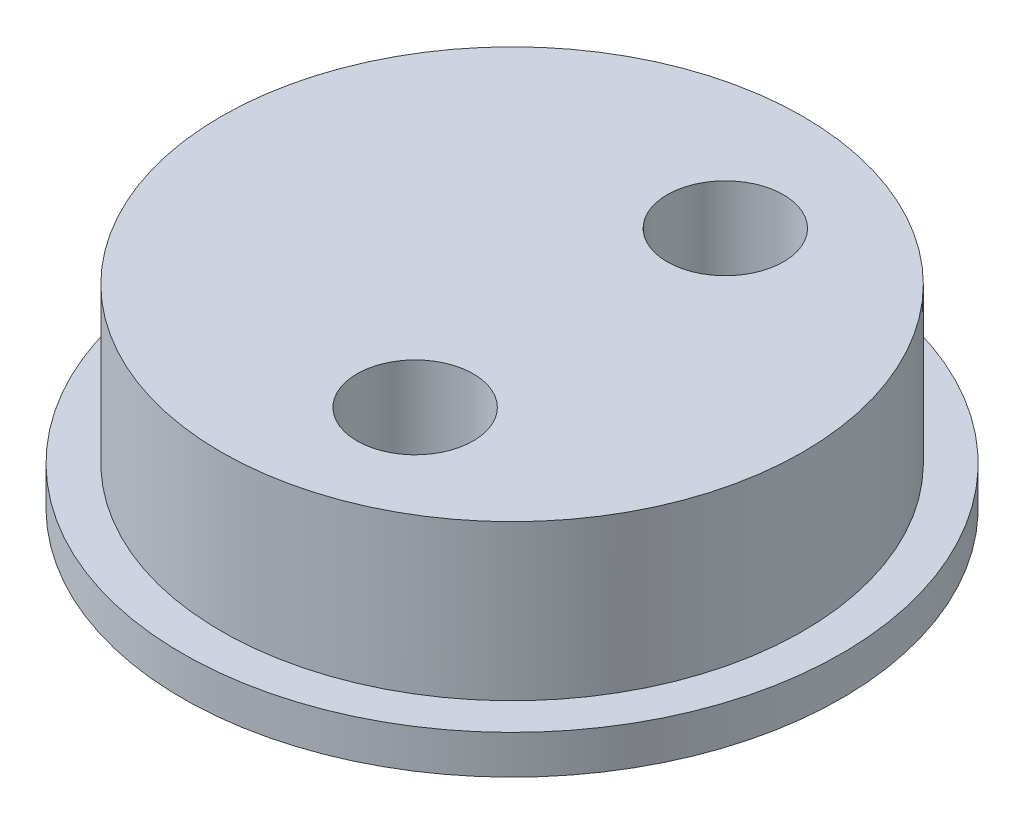
ISO-10303-21;
HEADER;
FILE_DESCRIPTION(('STEP AP214'),'2;1');
FILE_NAME('part.step','',(''),(''),'','','');
FILE_SCHEMA(('AUTOMOTIVE_DESIGN { 1 0 10303 214 1 1 1 1 }'));
ENDSEC;
DATA;
#1=APPLICATION_CONTEXT('core data for automotive mechanical design processes');
#2=APPLICATION_PROTOCOL_DEFINITION('international standard','automotive_design',2000,#1);
#3=PRODUCT_CONTEXT('',#1,'mechanical');
#4=PRODUCT('Part','Part','',(#3));
#5=PRODUCT_RELATED_PRODUCT_CATEGORY('part','',(#4));
#6=PRODUCT_DEFINITION_FORMATION('','',#4);
#7=PRODUCT_DEFINITION_CONTEXT('part definition',#1,'design');
#8=PRODUCT_DEFINITION('design','',#6,#7);
#9=PRODUCT_DEFINITION_SHAPE('','',#8);
#10=(LENGTH_UNIT() NAMED_UNIT(*) SI_UNIT(.MILLI.,.METRE.));
#11=(NAMED_UNIT(*) PLANE_ANGLE_UNIT() SI_UNIT($,.RADIAN.));
#12=(NAMED_UNIT(*) SI_UNIT($,.STERADIAN.) SOLID_ANGLE_UNIT());
#13=UNCERTAINTY_MEASURE_WITH_UNIT(LENGTH_MEASURE(1.E-05),#10,'distance_accuracy_value','');
#14=(GEOMETRIC_REPRESENTATION_CONTEXT(3) GLOBAL_UNCERTAINTY_ASSIGNED_CONTEXT((#13)) GLOBAL_UNIT_ASSIGNED_CONTEXT((#10,
#11,#12)) REPRESENTATION_CONTEXT('',''));
#15=CARTESIAN_POINT('',(0.,0.,0.));
#16=DIRECTION('',(0.,0.,1.));
#17=DIRECTION('',(1.,0.,0.));
#18=AXIS2_PLACEMENT_3D('',#15,#16,#17);
#19=CARTESIAN_POINT('',(-1.5,5.,0.));
#20=DIRECTION('',(0.,-1.,0.));
#21=DIRECTION('',(0.,0.,-1.));
#22=AXIS2_PLACEMENT_3D('',#19,#20,#21);
#23=CYLINDRICAL_SURFACE('',#22,7.5);
#24=CARTESIAN_POINT('',(-1.5,5.,0.));
#25=DIRECTION('',(0.,1.,0.));
#26=DIRECTION('',(0.,0.,1.));
#27=AXIS2_PLACEMENT_3D('',#24,#25,#26);
#28=CIRCLE('',#27,7.5);
#29=CARTESIAN_POINT('',(-1.5,5.,7.5));
#30=VERTEX_POINT('',#29);
#31=EDGE_CURVE('E37',#30,#30,#28,.T.);
#32=ORIENTED_EDGE('',*,*,#31,.F.);
#33=EDGE_LOOP('',(#32));
#34=FACE_BOUND('',#33,.T.);
#35=CARTESIAN_POINT('',(-1.5,1.,0.));
#36=DIRECTION('',(0.,-1.,0.));
#37=DIRECTION('',(0.,0.,-1.));
#38=AXIS2_PLACEMENT_3D('',#35,#36,#37);
#39=CIRCLE('',#38,7.5);
#40=CARTESIAN_POINT('',(-1.5,1.,-7.5));
#41=VERTEX_POINT('',#40);
#42=EDGE_CURVE('E10',#41,#41,#39,.T.);
#43=ORIENTED_EDGE('',*,*,#42,.F.);
#44=EDGE_LOOP('',(#43));
#45=FACE_BOUND('',#44,.T.);
#46=ADVANCED_FACE('F31',(#34,#45),#23,.T.);
#47=CARTESIAN_POINT('',(-1.5,5.,0.));
#48=DIRECTION('',(0.,1.,0.));
#49=DIRECTION('',(0.,0.,1.));
#50=AXIS2_PLACEMENT_3D('',#47,#48,#49);
#51=PLANE('',#50);
#52=CARTESIAN_POINT('',(0.,5.,-4.));
#53=DIRECTION('',(0.,1.,0.));
#54=DIRECTION('',(0.,0.,1.));
#55=AXIS2_PLACEMENT_3D('',#52,#53,#54);
#56=CIRCLE('',#55,1.5);
#57=CARTESIAN_POINT('',(0.,5.,-2.5));
#58=VERTEX_POINT('',#57);
#59=EDGE_CURVE('E57',#58,#58,#56,.T.);
#60=ORIENTED_EDGE('',*,*,#59,.F.);
#61=EDGE_LOOP('',(#60));
#62=FACE_BOUND('',#61,.T.);
#63=CARTESIAN_POINT('',(0.,5.,4.));
#64=DIRECTION('',(0.,1.,0.));
#65=DIRECTION('',(0.,0.,1.));
#66=AXIS2_PLACEMENT_3D('',#63,#64,#65);
#67=CIRCLE('',#66,1.5);
#68=CARTESIAN_POINT('',(0.,5.,5.5));
#69=VERTEX_POINT('',#68);
#70=EDGE_CURVE('E51',#69,#69,#67,.T.);
#71=ORIENTED_EDGE('',*,*,#70,.F.);
#72=EDGE_LOOP('',(#71));
#73=FACE_BOUND('',#72,.T.);
#74=ORIENTED_EDGE('',*,*,#31,.T.);
#75=EDGE_LOOP('',(#74));
#76=FACE_BOUND('',#75,.T.);
#77=ADVANCED_FACE('F73',(#62,#73,#76),#51,.T.);
#78=CARTESIAN_POINT('',(-1.5,1.,0.));
#79=DIRECTION('',(0.,-1.,0.));
#80=DIRECTION('',(0.,0.,-1.));
#81=AXIS2_PLACEMENT_3D('',#78,#79,#80);
#82=CYLINDRICAL_SURFACE('',#81,8.5);
#83=CARTESIAN_POINT('',(-1.5,1.,0.));
#84=DIRECTION('',(0.,-1.,0.));
#85=DIRECTION('',(0.,0.,-1.));
#86=AXIS2_PLACEMENT_3D('',#83,#84,#85);
#87=CIRCLE('',#86,8.5);
#88=CARTESIAN_POINT('',(-1.5,1.,-8.5));
#89=VERTEX_POINT('',#88);
#90=EDGE_CURVE('E41',#89,#89,#87,.T.);
#91=ORIENTED_EDGE('',*,*,#90,.T.);
#92=EDGE_LOOP('',(#91));
#93=FACE_BOUND('',#92,.T.);
#94=CARTESIAN_POINT('',(-1.5,0.,0.));
#95=DIRECTION('',(0.,-1.,0.));
#96=DIRECTION('',(0.,0.,-1.));
#97=AXIS2_PLACEMENT_3D('',#94,#95,#96);
#98=CIRCLE('',#97,8.5);
#99=CARTESIAN_POINT('',(-1.5,0.,-8.5));
#100=VERTEX_POINT('',#99);
#101=EDGE_CURVE('E45',#100,#100,#98,.T.);
#102=ORIENTED_EDGE('',*,*,#101,.F.);
#103=EDGE_LOOP('',(#102));
#104=FACE_BOUND('',#103,.T.);
#105=ADVANCED_FACE('F76',(#93,#104),#82,.T.);
#106=CARTESIAN_POINT('',(-1.5,1.,0.));
#107=DIRECTION('',(0.,-1.,0.));
#108=DIRECTION('',(0.,0.,-1.));
#109=AXIS2_PLACEMENT_3D('',#106,#107,#108);
#110=PLANE('',#109);
#111=ORIENTED_EDGE('',*,*,#42,.T.);
#112=EDGE_LOOP('',(#111));
#113=FACE_BOUND('',#112,.T.);
#114=ORIENTED_EDGE('',*,*,#90,.F.);
#115=EDGE_LOOP('',(#114));
#116=FACE_BOUND('',#115,.T.);
#117=ADVANCED_FACE('F86',(#113,#116),#110,.F.);
#118=CARTESIAN_POINT('',(-1.5,0.,0.));
#119=DIRECTION('',(0.,1.,0.));
#120=DIRECTION('',(0.,0.,1.));
#121=AXIS2_PLACEMENT_3D('',#118,#119,#120);
#122=PLANE('',#121);
#123=CARTESIAN_POINT('',(0.,0.,-4.));
#124=DIRECTION('',(0.,1.,0.));
#125=DIRECTION('',(0.,0.,1.));
#126=AXIS2_PLACEMENT_3D('',#123,#124,#125);
#127=CIRCLE('',#126,1.5);
#128=CARTESIAN_POINT('',(0.,0.,-2.5));
#129=VERTEX_POINT('',#128);
#130=EDGE_CURVE('E49',#129,#129,#127,.T.);
#131=ORIENTED_EDGE('',*,*,#130,.T.);
#132=EDGE_LOOP('',(#131));
#133=FACE_BOUND('',#132,.T.);
#134=CARTESIAN_POINT('',(0.,0.,4.));
#135=DIRECTION('',(0.,1.,0.));
#136=DIRECTION('',(0.,0.,1.));
#137=AXIS2_PLACEMENT_3D('',#134,#135,#136);
#138=CIRCLE('',#137,1.5);
#139=CARTESIAN_POINT('',(0.,0.,5.5));
#140=VERTEX_POINT('',#139);
#141=EDGE_CURVE('E54',#140,#140,#138,.T.);
#142=ORIENTED_EDGE('',*,*,#141,.T.);
#143=EDGE_LOOP('',(#142));
#144=FACE_BOUND('',#143,.T.);
#145=ORIENTED_EDGE('',*,*,#101,.T.);
#146=EDGE_LOOP('',(#145));
#147=FACE_BOUND('',#146,.T.);
#148=ADVANCED_FACE('F63',(#133,#144,#147),#122,.F.);
#149=CARTESIAN_POINT('',(0.,0.,4.));
#150=DIRECTION('',(0.,1.,0.));
#151=DIRECTION('',(0.,0.,1.));
#152=AXIS2_PLACEMENT_3D('',#149,#150,#151);
#153=CYLINDRICAL_SURFACE('',#152,1.5);
#154=ORIENTED_EDGE('',*,*,#141,.F.);
#155=EDGE_LOOP('',(#154));
#156=FACE_BOUND('',#155,.T.);
#157=ORIENTED_EDGE('',*,*,#70,.T.);
#158=EDGE_LOOP('',(#157));
#159=FACE_BOUND('',#158,.T.);
#160=ADVANCED_FACE('F69',(#156,#159),#153,.F.);
#161=CARTESIAN_POINT('',(0.,0.,-4.));
#162=DIRECTION('',(0.,1.,0.));
#163=DIRECTION('',(0.,0.,1.));
#164=AXIS2_PLACEMENT_3D('',#161,#162,#163);
#165=CYLINDRICAL_SURFACE('',#164,1.5);
#166=ORIENTED_EDGE('',*,*,#130,.F.);
#167=EDGE_LOOP('',(#166));
#168=FACE_BOUND('',#167,.T.);
#169=ORIENTED_EDGE('',*,*,#59,.T.);
#170=EDGE_LOOP('',(#169));
#171=FACE_BOUND('',#170,.T.);
#172=ADVANCED_FACE('F66',(#168,#171),#165,.F.);
#173=CLOSED_SHELL('',(#46,#77,#105,#117,#148,#160,#172));
#174=MANIFOLD_SOLID_BREP('B2',#173);
#175=ADVANCED_BREP_SHAPE_REPRESENTATION('',(#18,#174),#14);
#176=SHAPE_DEFINITION_REPRESENTATION(#9,#175);
ENDSEC;
END-ISO-10303-21;
